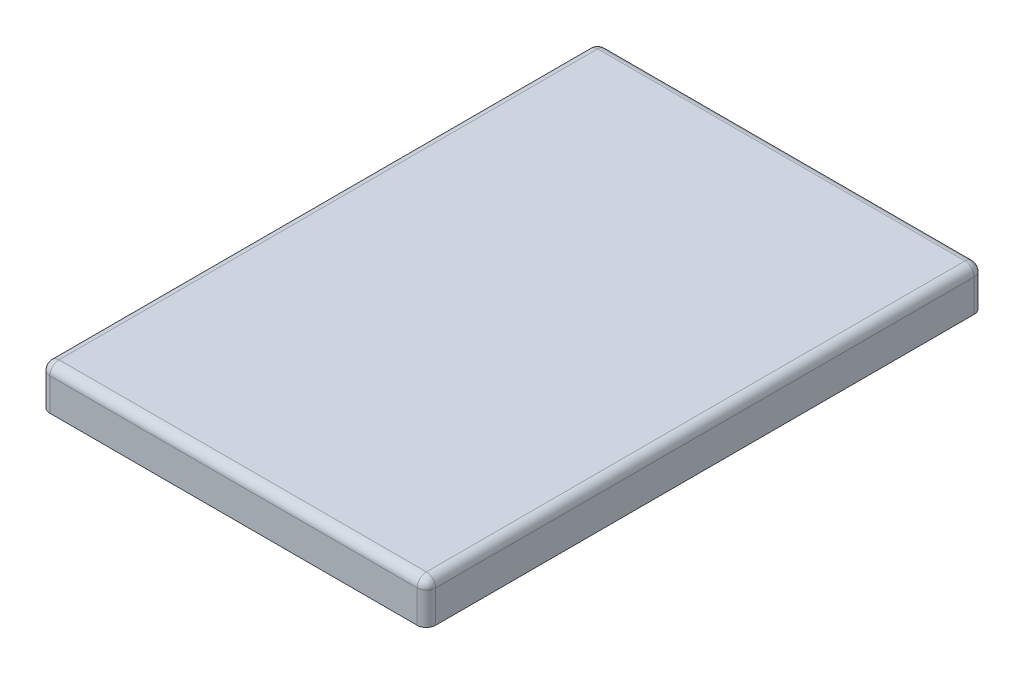
ISO-10303-21;
HEADER;
FILE_DESCRIPTION(('STEP AP214'),'2;1');
FILE_NAME('part.step','',(''),(''),'','','');
FILE_SCHEMA(('AUTOMOTIVE_DESIGN { 1 0 10303 214 1 1 1 1 }'));
ENDSEC;
DATA;
#1=APPLICATION_CONTEXT('core data for automotive mechanical design processes');
#2=APPLICATION_PROTOCOL_DEFINITION('international standard','automotive_design',2000,#1);
#3=PRODUCT_CONTEXT('',#1,'mechanical');
#4=PRODUCT('Part','Part','',(#3));
#5=PRODUCT_RELATED_PRODUCT_CATEGORY('part','',(#4));
#6=PRODUCT_DEFINITION_FORMATION('','',#4);
#7=PRODUCT_DEFINITION_CONTEXT('part definition',#1,'design');
#8=PRODUCT_DEFINITION('design','',#6,#7);
#9=PRODUCT_DEFINITION_SHAPE('','',#8);
#10=(LENGTH_UNIT() NAMED_UNIT(*) SI_UNIT(.MILLI.,.METRE.));
#11=(NAMED_UNIT(*) PLANE_ANGLE_UNIT() SI_UNIT($,.RADIAN.));
#12=(NAMED_UNIT(*) SI_UNIT($,.STERADIAN.) SOLID_ANGLE_UNIT());
#13=UNCERTAINTY_MEASURE_WITH_UNIT(LENGTH_MEASURE(1.E-05),#10,'distance_accuracy_value','');
#14=(GEOMETRIC_REPRESENTATION_CONTEXT(3) GLOBAL_UNCERTAINTY_ASSIGNED_CONTEXT((#13)) GLOBAL_UNIT_ASSIGNED_CONTEXT((#10,
#11,#12)) REPRESENTATION_CONTEXT('',''));
#15=CARTESIAN_POINT('',(0.,0.,0.));
#16=DIRECTION('',(0.,0.,1.));
#17=DIRECTION('',(1.,0.,0.));
#18=AXIS2_PLACEMENT_3D('',#15,#16,#17);
#19=CARTESIAN_POINT('',(0.,-69.3057325889171,0.));
#20=DIRECTION('',(0.,1.,0.));
#21=DIRECTION('',(0.,0.,1.));
#22=AXIS2_PLACEMENT_3D('',#19,#20,#21);
#23=PLANE('',#22);
#24=DIRECTION('',(1.,0.,0.));
#25=VECTOR('',#24,1.);
#26=CARTESIAN_POINT('',(0.,-69.3057325889171,30.));
#27=LINE('',#26,#25);
#28=CARTESIAN_POINT('',(21.75,-69.3057325889171,30.));
#29=VERTEX_POINT('',#28);
#30=CARTESIAN_POINT('',(61.45,-69.3057325889171,30.));
#31=VERTEX_POINT('',#30);
#32=EDGE_CURVE('E353',#29,#31,#27,.T.);
#33=ORIENTED_EDGE('',*,*,#32,.F.);
#34=CARTESIAN_POINT('',(21.75,-69.3057325889171,29.));
#35=DIRECTION('',(0.,1.,0.));
#36=DIRECTION('',(0.,0.,1.));
#37=AXIS2_PLACEMENT_3D('',#34,#35,#36);
#38=CIRCLE('',#37,1.);
#39=CARTESIAN_POINT('',(20.75,-69.3057325889171,29.));
#40=VERTEX_POINT('',#39);
#41=EDGE_CURVE('E395',#29,#40,#38,.F.);
#42=ORIENTED_EDGE('',*,*,#41,.T.);
#43=DIRECTION('',(0.,0.,-1.));
#44=VECTOR('',#43,1.);
#45=CARTESIAN_POINT('',(20.75,-69.3057325889171,0.));
#46=LINE('',#45,#44);
#47=CARTESIAN_POINT('',(20.75,-69.3057325889171,-29.2));
#48=VERTEX_POINT('',#47);
#49=EDGE_CURVE('E350',#40,#48,#46,.T.);
#50=ORIENTED_EDGE('',*,*,#49,.T.);
#51=CARTESIAN_POINT('',(21.75,-69.3057325889171,-29.2));
#52=DIRECTION('',(0.,1.,0.));
#53=DIRECTION('',(0.,0.,1.));
#54=AXIS2_PLACEMENT_3D('',#51,#52,#53);
#55=CIRCLE('',#54,1.);
#56=CARTESIAN_POINT('',(21.75,-69.3057325889171,-30.2));
#57=VERTEX_POINT('',#56);
#58=EDGE_CURVE('E391',#48,#57,#55,.F.);
#59=ORIENTED_EDGE('',*,*,#58,.T.);
#60=DIRECTION('',(1.,0.,0.));
#61=VECTOR('',#60,1.);
#62=CARTESIAN_POINT('',(0.,-69.3057325889171,-30.2));
#63=LINE('',#62,#61);
#64=CARTESIAN_POINT('',(61.45,-69.3057325889171,-30.2));
#65=VERTEX_POINT('',#64);
#66=EDGE_CURVE('E358',#57,#65,#63,.T.);
#67=ORIENTED_EDGE('',*,*,#66,.T.);
#68=CARTESIAN_POINT('',(61.45,-69.3057325889171,-29.2));
#69=DIRECTION('',(0.,1.,0.));
#70=DIRECTION('',(0.,0.,1.));
#71=AXIS2_PLACEMENT_3D('',#68,#69,#70);
#72=CIRCLE('',#71,1.);
#73=CARTESIAN_POINT('',(62.45,-69.3057325889171,-29.2));
#74=VERTEX_POINT('',#73);
#75=EDGE_CURVE('E389',#65,#74,#72,.F.);
#76=ORIENTED_EDGE('',*,*,#75,.T.);
#77=DIRECTION('',(0.,0.,-1.));
#78=VECTOR('',#77,1.);
#79=CARTESIAN_POINT('',(62.45,-69.3057325889171,0.));
#80=LINE('',#79,#78);
#81=CARTESIAN_POINT('',(62.45,-69.3057325889171,29.));
#82=VERTEX_POINT('',#81);
#83=EDGE_CURVE('E356',#82,#74,#80,.T.);
#84=ORIENTED_EDGE('',*,*,#83,.F.);
#85=CARTESIAN_POINT('',(61.45,-69.3057325889171,29.));
#86=DIRECTION('',(0.,1.,0.));
#87=DIRECTION('',(0.,0.,1.));
#88=AXIS2_PLACEMENT_3D('',#85,#86,#87);
#89=CIRCLE('',#88,1.);
#90=EDGE_CURVE('E393',#82,#31,#89,.F.);
#91=ORIENTED_EDGE('',*,*,#90,.T.);
#92=EDGE_LOOP('',(#33,#42,#50,#59,#67,#76,#84,#91));
#93=FACE_BOUND('',#92,.T.);
#94=DIRECTION('',(1.,0.,0.));
#95=VECTOR('',#94,1.);
#96=CARTESIAN_POINT('',(0.,-69.3057325889171,28.75));
#97=LINE('',#96,#95);
#98=CARTESIAN_POINT('',(22.,-69.3057325889171,28.75));
#99=VERTEX_POINT('',#98);
#100=CARTESIAN_POINT('',(61.2,-69.3057325889171,28.75));
#101=VERTEX_POINT('',#100);
#102=EDGE_CURVE('E311',#99,#101,#97,.T.);
#103=ORIENTED_EDGE('',*,*,#102,.T.);
#104=DIRECTION('',(0.,0.,-1.));
#105=VECTOR('',#104,1.);
#106=CARTESIAN_POINT('',(61.2,-69.3057325889171,0.));
#107=LINE('',#106,#105);
#108=CARTESIAN_POINT('',(61.2,-69.3057325889171,-28.95));
#109=VERTEX_POINT('',#108);
#110=EDGE_CURVE('E333',#101,#109,#107,.T.);
#111=ORIENTED_EDGE('',*,*,#110,.T.);
#112=DIRECTION('',(1.,0.,0.));
#113=VECTOR('',#112,1.);
#114=CARTESIAN_POINT('',(0.,-69.3057325889171,-28.95));
#115=LINE('',#114,#113);
#116=CARTESIAN_POINT('',(22.,-69.3057325889171,-28.95));
#117=VERTEX_POINT('',#116);
#118=EDGE_CURVE('E336',#117,#109,#115,.T.);
#119=ORIENTED_EDGE('',*,*,#118,.F.);
#120=DIRECTION('',(0.,0.,-1.));
#121=VECTOR('',#120,1.);
#122=CARTESIAN_POINT('',(22.,-69.3057325889171,0.));
#123=LINE('',#122,#121);
#124=EDGE_CURVE('E322',#99,#117,#123,.T.);
#125=ORIENTED_EDGE('',*,*,#124,.F.);
#126=EDGE_LOOP('',(#103,#111,#119,#125));
#127=FACE_BOUND('',#126,.T.);
#128=ADVANCED_FACE('F39',(#93,#127),#23,.F.);
#129=CARTESIAN_POINT('',(20.75,-64.8057325889171,0.));
#130=DIRECTION('',(-1.,0.,0.));
#131=DIRECTION('',(0.,0.,1.));
#132=AXIS2_PLACEMENT_3D('',#129,#130,#131);
#133=PLANE('',#132);
#134=ORIENTED_EDGE('',*,*,#49,.F.);
#135=DIRECTION('',(0.,-1.,0.));
#136=VECTOR('',#135,1.);
#137=CARTESIAN_POINT('',(20.75,-64.8057325889171,29.));
#138=LINE('',#137,#136);
#139=CARTESIAN_POINT('',(20.75,-65.8057325889171,29.));
#140=VERTEX_POINT('',#139);
#141=EDGE_CURVE('E387',#40,#140,#138,.F.);
#142=ORIENTED_EDGE('',*,*,#141,.T.);
#143=DIRECTION('',(0.,0.,-1.));
#144=VECTOR('',#143,1.);
#145=CARTESIAN_POINT('',(20.75,-65.8057325889171,0.));
#146=LINE('',#145,#144);
#147=CARTESIAN_POINT('',(20.75,-65.8057325889171,-29.2));
#148=VERTEX_POINT('',#147);
#149=EDGE_CURVE('E385',#140,#148,#146,.T.);
#150=ORIENTED_EDGE('',*,*,#149,.T.);
#151=DIRECTION('',(0.,-1.,0.));
#152=VECTOR('',#151,1.);
#153=CARTESIAN_POINT('',(20.75,-64.8057325889171,-29.2));
#154=LINE('',#153,#152);
#155=EDGE_CURVE('E383',#148,#48,#154,.T.);
#156=ORIENTED_EDGE('',*,*,#155,.T.);
#157=EDGE_LOOP('',(#134,#142,#150,#156));
#158=FACE_BOUND('',#157,.T.);
#159=ADVANCED_FACE('F445',(#158),#133,.T.);
#160=CARTESIAN_POINT('',(0.,-64.8057325889171,30.));
#161=DIRECTION('',(0.,0.,-1.));
#162=DIRECTION('',(-1.,0.,0.));
#163=AXIS2_PLACEMENT_3D('',#160,#161,#162);
#164=PLANE('',#163);
#165=DIRECTION('',(1.,0.,0.));
#166=VECTOR('',#165,1.);
#167=CARTESIAN_POINT('',(20.75,-65.8057325889171,30.));
#168=LINE('',#167,#166);
#169=CARTESIAN_POINT('',(61.45,-65.8057325889171,30.));
#170=VERTEX_POINT('',#169);
#171=CARTESIAN_POINT('',(21.75,-65.8057325889171,30.));
#172=VERTEX_POINT('',#171);
#173=EDGE_CURVE('E379',#170,#172,#168,.F.);
#174=ORIENTED_EDGE('',*,*,#173,.T.);
#175=DIRECTION('',(0.,-1.,0.));
#176=VECTOR('',#175,1.);
#177=CARTESIAN_POINT('',(21.75,-69.3057325889171,30.));
#178=LINE('',#177,#176);
#179=EDGE_CURVE('E381',#172,#29,#178,.T.);
#180=ORIENTED_EDGE('',*,*,#179,.T.);
#181=ORIENTED_EDGE('',*,*,#32,.T.);
#182=DIRECTION('',(0.,-1.,0.));
#183=VECTOR('',#182,1.);
#184=CARTESIAN_POINT('',(61.45,-64.8057325889171,30.));
#185=LINE('',#184,#183);
#186=EDGE_CURVE('E377',#31,#170,#185,.F.);
#187=ORIENTED_EDGE('',*,*,#186,.T.);
#188=EDGE_LOOP('',(#174,#180,#181,#187));
#189=FACE_BOUND('',#188,.T.);
#190=ADVANCED_FACE('F486',(#189),#164,.F.);
#191=CARTESIAN_POINT('',(62.45,-64.8057325889171,0.));
#192=DIRECTION('',(-1.,0.,0.));
#193=DIRECTION('',(0.,0.,1.));
#194=AXIS2_PLACEMENT_3D('',#191,#192,#193);
#195=PLANE('',#194);
#196=DIRECTION('',(0.,0.,-1.));
#197=VECTOR('',#196,1.);
#198=CARTESIAN_POINT('',(62.45,-65.8057325889171,30.));
#199=LINE('',#198,#197);
#200=CARTESIAN_POINT('',(62.45,-65.8057325889171,-29.2));
#201=VERTEX_POINT('',#200);
#202=CARTESIAN_POINT('',(62.45,-65.8057325889171,29.));
#203=VERTEX_POINT('',#202);
#204=EDGE_CURVE('E55',#201,#203,#199,.F.);
#205=ORIENTED_EDGE('',*,*,#204,.T.);
#206=DIRECTION('',(0.,-1.,0.));
#207=VECTOR('',#206,1.);
#208=CARTESIAN_POINT('',(62.45,-64.8057325889171,29.));
#209=LINE('',#208,#207);
#210=EDGE_CURVE('E11',#203,#82,#209,.T.);
#211=ORIENTED_EDGE('',*,*,#210,.T.);
#212=ORIENTED_EDGE('',*,*,#83,.T.);
#213=DIRECTION('',(0.,-1.,0.));
#214=VECTOR('',#213,1.);
#215=CARTESIAN_POINT('',(62.45,-64.8057325889171,-29.2));
#216=LINE('',#215,#214);
#217=EDGE_CURVE('E48',#74,#201,#216,.F.);
#218=ORIENTED_EDGE('',*,*,#217,.T.);
#219=EDGE_LOOP('',(#205,#211,#212,#218));
#220=FACE_BOUND('',#219,.T.);
#221=ADVANCED_FACE('F467',(#220),#195,.F.);
#222=CARTESIAN_POINT('',(0.,-64.8057325889171,-30.2));
#223=DIRECTION('',(0.,0.,-1.));
#224=DIRECTION('',(-1.,0.,0.));
#225=AXIS2_PLACEMENT_3D('',#222,#223,#224);
#226=PLANE('',#225);
#227=ORIENTED_EDGE('',*,*,#66,.F.);
#228=DIRECTION('',(0.,-1.,0.));
#229=VECTOR('',#228,1.);
#230=CARTESIAN_POINT('',(21.75,-64.8057325889171,-30.2));
#231=LINE('',#230,#229);
#232=CARTESIAN_POINT('',(21.75,-65.8057325889171,-30.2));
#233=VERTEX_POINT('',#232);
#234=EDGE_CURVE('E366',#57,#233,#231,.F.);
#235=ORIENTED_EDGE('',*,*,#234,.T.);
#236=DIRECTION('',(1.,0.,0.));
#237=VECTOR('',#236,1.);
#238=CARTESIAN_POINT('',(0.,-65.8057325889171,-30.2));
#239=LINE('',#238,#237);
#240=CARTESIAN_POINT('',(61.45,-65.8057325889171,-30.2));
#241=VERTEX_POINT('',#240);
#242=EDGE_CURVE('E363',#233,#241,#239,.T.);
#243=ORIENTED_EDGE('',*,*,#242,.T.);
#244=DIRECTION('',(0.,-1.,0.));
#245=VECTOR('',#244,1.);
#246=CARTESIAN_POINT('',(61.45,-69.3057325889171,-30.2));
#247=LINE('',#246,#245);
#248=EDGE_CURVE('E361',#241,#65,#247,.T.);
#249=ORIENTED_EDGE('',*,*,#248,.T.);
#250=EDGE_LOOP('',(#227,#235,#243,#249));
#251=FACE_BOUND('',#250,.T.);
#252=ADVANCED_FACE('F459',(#251),#226,.T.);
#253=CARTESIAN_POINT('',(0.,-64.8057325889171,0.));
#254=DIRECTION('',(0.,1.,0.));
#255=DIRECTION('',(0.,0.,1.));
#256=AXIS2_PLACEMENT_3D('',#253,#254,#255);
#257=PLANE('',#256);
#258=DIRECTION('',(1.,0.,0.));
#259=VECTOR('',#258,1.);
#260=CARTESIAN_POINT('',(0.,-64.8057325889171,-29.2));
#261=LINE('',#260,#259);
#262=CARTESIAN_POINT('',(61.45,-64.8057325889171,-29.2));
#263=VERTEX_POINT('',#262);
#264=CARTESIAN_POINT('',(21.75,-64.8057325889171,-29.2));
#265=VERTEX_POINT('',#264);
#266=EDGE_CURVE('E372',#263,#265,#261,.F.);
#267=ORIENTED_EDGE('',*,*,#266,.T.);
#268=DIRECTION('',(0.,0.,-1.));
#269=VECTOR('',#268,1.);
#270=CARTESIAN_POINT('',(21.75,-64.8057325889171,0.));
#271=LINE('',#270,#269);
#272=CARTESIAN_POINT('',(21.75,-64.8057325889171,29.));
#273=VERTEX_POINT('',#272);
#274=EDGE_CURVE('E375',#265,#273,#271,.F.);
#275=ORIENTED_EDGE('',*,*,#274,.T.);
#276=DIRECTION('',(1.,0.,0.));
#277=VECTOR('',#276,1.);
#278=CARTESIAN_POINT('',(62.45,-64.8057325889171,29.));
#279=LINE('',#278,#277);
#280=CARTESIAN_POINT('',(61.45,-64.8057325889171,29.));
#281=VERTEX_POINT('',#280);
#282=EDGE_CURVE('E370',#273,#281,#279,.T.);
#283=ORIENTED_EDGE('',*,*,#282,.T.);
#284=DIRECTION('',(0.,0.,-1.));
#285=VECTOR('',#284,1.);
#286=CARTESIAN_POINT('',(61.45,-64.8057325889171,-30.2));
#287=LINE('',#286,#285);
#288=EDGE_CURVE('E368',#281,#263,#287,.T.);
#289=ORIENTED_EDGE('',*,*,#288,.T.);
#290=EDGE_LOOP('',(#267,#275,#283,#289));
#291=FACE_BOUND('',#290,.T.);
#292=ADVANCED_FACE('F482',(#291),#257,.T.);
#293=CARTESIAN_POINT('',(0.,-66.6557325889171,28.75));
#294=DIRECTION('',(0.,0.,-1.));
#295=DIRECTION('',(-1.,0.,0.));
#296=AXIS2_PLACEMENT_3D('',#293,#294,#295);
#297=PLANE('',#296);
#298=DIRECTION('',(0.,-1.,0.));
#299=VECTOR('',#298,1.);
#300=CARTESIAN_POINT('',(51.2,-67.6057325889171,28.75));
#301=LINE('',#300,#299);
#302=CARTESIAN_POINT('',(51.2,-67.6057325889171,28.75));
#303=VERTEX_POINT('',#302);
#304=CARTESIAN_POINT('',(51.2,-68.5057325889171,28.75));
#305=VERTEX_POINT('',#304);
#306=EDGE_CURVE('E218',#303,#305,#301,.T.);
#307=ORIENTED_EDGE('',*,*,#306,.F.);
#308=DIRECTION('',(1.,0.,0.));
#309=VECTOR('',#308,1.);
#310=CARTESIAN_POINT('',(51.2,-67.6057325889171,28.75));
#311=LINE('',#310,#309);
#312=CARTESIAN_POINT('',(32.,-67.6057325889171,28.75));
#313=VERTEX_POINT('',#312);
#314=EDGE_CURVE('E235',#313,#303,#311,.T.);
#315=ORIENTED_EDGE('',*,*,#314,.F.);
#316=DIRECTION('',(0.,1.,0.));
#317=VECTOR('',#316,1.);
#318=CARTESIAN_POINT('',(32.,-67.6057325889171,28.75));
#319=LINE('',#318,#317);
#320=CARTESIAN_POINT('',(32.,-68.5057325889171,28.75));
#321=VERTEX_POINT('',#320);
#322=EDGE_CURVE('E238',#321,#313,#319,.T.);
#323=ORIENTED_EDGE('',*,*,#322,.F.);
#324=DIRECTION('',(-1.,0.,0.));
#325=VECTOR('',#324,1.);
#326=CARTESIAN_POINT('',(51.2,-68.5057325889171,28.75));
#327=LINE('',#326,#325);
#328=EDGE_CURVE('E244',#305,#321,#327,.T.);
#329=ORIENTED_EDGE('',*,*,#328,.F.);
#330=EDGE_LOOP('',(#307,#315,#323,#329));
#331=FACE_BOUND('',#330,.T.);
#332=ORIENTED_EDGE('',*,*,#102,.F.);
#333=DIRECTION('',(0.,-1.,0.));
#334=VECTOR('',#333,1.);
#335=CARTESIAN_POINT('',(22.,-66.6557325889171,28.75));
#336=LINE('',#335,#334);
#337=CARTESIAN_POINT('',(22.,-66.6557325889171,28.75));
#338=VERTEX_POINT('',#337);
#339=EDGE_CURVE('E330',#338,#99,#336,.T.);
#340=ORIENTED_EDGE('',*,*,#339,.F.);
#341=DIRECTION('',(1.,0.,0.));
#342=VECTOR('',#341,1.);
#343=CARTESIAN_POINT('',(0.,-66.6557325889171,28.75));
#344=LINE('',#343,#342);
#345=CARTESIAN_POINT('',(61.2,-66.6557325889171,28.75));
#346=VERTEX_POINT('',#345);
#347=EDGE_CURVE('E318',#338,#346,#344,.T.);
#348=ORIENTED_EDGE('',*,*,#347,.T.);
#349=DIRECTION('',(0.,-1.,0.));
#350=VECTOR('',#349,1.);
#351=CARTESIAN_POINT('',(61.2,-66.6557325889171,28.75));
#352=LINE('',#351,#350);
#353=EDGE_CURVE('E347',#346,#101,#352,.T.);
#354=ORIENTED_EDGE('',*,*,#353,.T.);
#355=EDGE_LOOP('',(#332,#340,#348,#354));
#356=FACE_BOUND('',#355,.T.);
#357=ADVANCED_FACE('F829',(#331,#356),#297,.T.);
#358=CARTESIAN_POINT('',(61.2,-66.6557325889171,0.));
#359=DIRECTION('',(-1.,0.,0.));
#360=DIRECTION('',(0.,0.,1.));
#361=AXIS2_PLACEMENT_3D('',#358,#359,#360);
#362=PLANE('',#361);
#363=DIRECTION('',(0.,-1.,0.));
#364=VECTOR('',#363,1.);
#365=CARTESIAN_POINT('',(61.2,-67.4557325889171,-18.95));
#366=LINE('',#365,#364);
#367=CARTESIAN_POINT('',(61.2,-67.4557325889171,-18.95));
#368=VERTEX_POINT('',#367);
#369=CARTESIAN_POINT('',(61.2,-68.5057325889171,-18.95));
#370=VERTEX_POINT('',#369);
#371=EDGE_CURVE('E250',#368,#370,#366,.T.);
#372=ORIENTED_EDGE('',*,*,#371,.F.);
#373=DIRECTION('',(0.,0.,-1.));
#374=VECTOR('',#373,1.);
#375=CARTESIAN_POINT('',(61.2,-67.4557325889171,-18.95));
#376=LINE('',#375,#374);
#377=CARTESIAN_POINT('',(61.2,-67.4557325889171,18.75));
#378=VERTEX_POINT('',#377);
#379=EDGE_CURVE('E258',#378,#368,#376,.T.);
#380=ORIENTED_EDGE('',*,*,#379,.F.);
#381=DIRECTION('',(0.,1.,0.));
#382=VECTOR('',#381,1.);
#383=CARTESIAN_POINT('',(61.2,-67.4557325889171,18.75));
#384=LINE('',#383,#382);
#385=CARTESIAN_POINT('',(61.2,-68.5057325889171,18.75));
#386=VERTEX_POINT('',#385);
#387=EDGE_CURVE('E272',#386,#378,#384,.T.);
#388=ORIENTED_EDGE('',*,*,#387,.F.);
#389=DIRECTION('',(0.,0.,1.));
#390=VECTOR('',#389,1.);
#391=CARTESIAN_POINT('',(61.2,-68.5057325889171,-18.95));
#392=LINE('',#391,#390);
#393=EDGE_CURVE('E269',#370,#386,#392,.T.);
#394=ORIENTED_EDGE('',*,*,#393,.F.);
#395=EDGE_LOOP('',(#372,#380,#388,#394));
#396=FACE_BOUND('',#395,.T.);
#397=ORIENTED_EDGE('',*,*,#110,.F.);
#398=ORIENTED_EDGE('',*,*,#353,.F.);
#399=DIRECTION('',(0.,0.,-1.));
#400=VECTOR('',#399,1.);
#401=CARTESIAN_POINT('',(61.2,-66.6557325889171,0.));
#402=LINE('',#401,#400);
#403=CARTESIAN_POINT('',(61.2,-66.6557325889171,-28.95));
#404=VERTEX_POINT('',#403);
#405=EDGE_CURVE('E321',#346,#404,#402,.T.);
#406=ORIENTED_EDGE('',*,*,#405,.T.);
#407=DIRECTION('',(0.,-1.,0.));
#408=VECTOR('',#407,1.);
#409=CARTESIAN_POINT('',(61.2,-66.6557325889171,-28.95));
#410=LINE('',#409,#408);
#411=EDGE_CURVE('E345',#404,#109,#410,.T.);
#412=ORIENTED_EDGE('',*,*,#411,.T.);
#413=EDGE_LOOP('',(#397,#398,#406,#412));
#414=FACE_BOUND('',#413,.T.);
#415=ADVANCED_FACE('F819',(#396,#414),#362,.T.);
#416=CARTESIAN_POINT('',(0.,-66.6557325889171,-28.95));
#417=DIRECTION('',(0.,0.,-1.));
#418=DIRECTION('',(-1.,0.,0.));
#419=AXIS2_PLACEMENT_3D('',#416,#417,#418);
#420=PLANE('',#419);
#421=DIRECTION('',(1.,0.,0.));
#422=VECTOR('',#421,1.);
#423=CARTESIAN_POINT('',(41.15,-68.5057325889171,-28.95));
#424=LINE('',#423,#422);
#425=CARTESIAN_POINT('',(41.15,-68.5057325889171,-28.95));
#426=VERTEX_POINT('',#425);
#427=CARTESIAN_POINT('',(58.2,-68.5057325889171,-28.95));
#428=VERTEX_POINT('',#427);
#429=EDGE_CURVE('E301',#426,#428,#424,.T.);
#430=ORIENTED_EDGE('',*,*,#429,.F.);
#431=DIRECTION('',(0.,-1.,0.));
#432=VECTOR('',#431,1.);
#433=CARTESIAN_POINT('',(41.15,-67.6057325889171,-28.95));
#434=LINE('',#433,#432);
#435=CARTESIAN_POINT('',(41.15,-67.6057325889171,-28.95));
#436=VERTEX_POINT('',#435);
#437=EDGE_CURVE('E279',#436,#426,#434,.T.);
#438=ORIENTED_EDGE('',*,*,#437,.F.);
#439=DIRECTION('',(-1.,0.,0.));
#440=VECTOR('',#439,1.);
#441=CARTESIAN_POINT('',(41.15,-67.6057325889171,-28.95));
#442=LINE('',#441,#440);
#443=CARTESIAN_POINT('',(58.2,-67.6057325889171,-28.95));
#444=VERTEX_POINT('',#443);
#445=EDGE_CURVE('E290',#444,#436,#442,.T.);
#446=ORIENTED_EDGE('',*,*,#445,.F.);
#447=DIRECTION('',(0.,1.,0.));
#448=VECTOR('',#447,1.);
#449=CARTESIAN_POINT('',(58.2,-67.6057325889171,-28.95));
#450=LINE('',#449,#448);
#451=EDGE_CURVE('E304',#428,#444,#450,.T.);
#452=ORIENTED_EDGE('',*,*,#451,.F.);
#453=EDGE_LOOP('',(#430,#438,#446,#452));
#454=FACE_BOUND('',#453,.T.);
#455=ORIENTED_EDGE('',*,*,#118,.T.);
#456=ORIENTED_EDGE('',*,*,#411,.F.);
#457=DIRECTION('',(1.,0.,0.));
#458=VECTOR('',#457,1.);
#459=CARTESIAN_POINT('',(0.,-66.6557325889171,-28.95));
#460=LINE('',#459,#458);
#461=CARTESIAN_POINT('',(22.,-66.6557325889171,-28.95));
#462=VERTEX_POINT('',#461);
#463=EDGE_CURVE('E324',#462,#404,#460,.T.);
#464=ORIENTED_EDGE('',*,*,#463,.F.);
#465=DIRECTION('',(0.,-1.,0.));
#466=VECTOR('',#465,1.);
#467=CARTESIAN_POINT('',(22.,-66.6557325889171,-28.95));
#468=LINE('',#467,#466);
#469=EDGE_CURVE('E343',#462,#117,#468,.T.);
#470=ORIENTED_EDGE('',*,*,#469,.T.);
#471=EDGE_LOOP('',(#455,#456,#464,#470));
#472=FACE_BOUND('',#471,.T.);
#473=ADVANCED_FACE('F809',(#454,#472),#420,.F.);
#474=CARTESIAN_POINT('',(22.,-66.6557325889171,0.));
#475=DIRECTION('',(-1.,0.,0.));
#476=DIRECTION('',(0.,0.,1.));
#477=AXIS2_PLACEMENT_3D('',#474,#475,#476);
#478=PLANE('',#477);
#479=ORIENTED_EDGE('',*,*,#124,.T.);
#480=ORIENTED_EDGE('',*,*,#469,.F.);
#481=DIRECTION('',(0.,0.,-1.));
#482=VECTOR('',#481,1.);
#483=CARTESIAN_POINT('',(22.,-66.6557325889171,0.));
#484=LINE('',#483,#482);
#485=EDGE_CURVE('E327',#338,#462,#484,.T.);
#486=ORIENTED_EDGE('',*,*,#485,.F.);
#487=ORIENTED_EDGE('',*,*,#339,.T.);
#488=EDGE_LOOP('',(#479,#480,#486,#487));
#489=FACE_BOUND('',#488,.T.);
#490=ADVANCED_FACE('F798',(#489),#478,.F.);
#491=CARTESIAN_POINT('',(0.,-66.6557325889171,0.));
#492=DIRECTION('',(0.,1.,0.));
#493=DIRECTION('',(0.,0.,1.));
#494=AXIS2_PLACEMENT_3D('',#491,#492,#493);
#495=PLANE('',#494);
#496=ORIENTED_EDGE('',*,*,#347,.F.);
#497=ORIENTED_EDGE('',*,*,#485,.T.);
#498=ORIENTED_EDGE('',*,*,#463,.T.);
#499=ORIENTED_EDGE('',*,*,#405,.F.);
#500=EDGE_LOOP('',(#496,#497,#498,#499));
#501=FACE_BOUND('',#500,.T.);
#502=ADVANCED_FACE('F786',(#501),#495,.F.);
#503=CARTESIAN_POINT('',(41.15,-67.6057325889171,-29.7));
#504=DIRECTION('',(-1.,0.,0.));
#505=DIRECTION('',(0.,-1.,0.));
#506=AXIS2_PLACEMENT_3D('',#503,#504,#505);
#507=PLANE('',#506);
#508=ORIENTED_EDGE('',*,*,#437,.T.);
#509=DIRECTION('',(0.,0.,1.));
#510=VECTOR('',#509,1.);
#511=CARTESIAN_POINT('',(41.15,-68.5057325889171,-29.7));
#512=LINE('',#511,#510);
#513=CARTESIAN_POINT('',(41.15,-68.5057325889171,-29.7));
#514=VERTEX_POINT('',#513);
#515=EDGE_CURVE('E299',#514,#426,#512,.T.);
#516=ORIENTED_EDGE('',*,*,#515,.F.);
#517=DIRECTION('',(0.,-1.,0.));
#518=VECTOR('',#517,1.);
#519=CARTESIAN_POINT('',(41.15,-67.6057325889171,-29.7));
#520=LINE('',#519,#518);
#521=CARTESIAN_POINT('',(41.15,-67.6057325889171,-29.7));
#522=VERTEX_POINT('',#521);
#523=EDGE_CURVE('E286',#522,#514,#520,.T.);
#524=ORIENTED_EDGE('',*,*,#523,.F.);
#525=DIRECTION('',(0.,0.,1.));
#526=VECTOR('',#525,1.);
#527=CARTESIAN_POINT('',(41.15,-67.6057325889171,-29.7));
#528=LINE('',#527,#526);
#529=EDGE_CURVE('E309',#522,#436,#528,.T.);
#530=ORIENTED_EDGE('',*,*,#529,.T.);
#531=EDGE_LOOP('',(#508,#516,#524,#530));
#532=FACE_BOUND('',#531,.T.);
#533=ADVANCED_FACE('F775',(#532),#507,.F.);
#534=CARTESIAN_POINT('',(41.15,-67.6057325889171,-29.7));
#535=DIRECTION('',(0.,1.,0.));
#536=DIRECTION('',(0.,0.,1.));
#537=AXIS2_PLACEMENT_3D('',#534,#535,#536);
#538=PLANE('',#537);
#539=ORIENTED_EDGE('',*,*,#445,.T.);
#540=ORIENTED_EDGE('',*,*,#529,.F.);
#541=DIRECTION('',(-1.,0.,0.));
#542=VECTOR('',#541,1.);
#543=CARTESIAN_POINT('',(41.15,-67.6057325889171,-29.7));
#544=LINE('',#543,#542);
#545=CARTESIAN_POINT('',(58.2,-67.6057325889171,-29.7));
#546=VERTEX_POINT('',#545);
#547=EDGE_CURVE('E296',#546,#522,#544,.T.);
#548=ORIENTED_EDGE('',*,*,#547,.F.);
#549=DIRECTION('',(0.,0.,1.));
#550=VECTOR('',#549,1.);
#551=CARTESIAN_POINT('',(58.2,-67.6057325889171,-29.7));
#552=LINE('',#551,#550);
#553=EDGE_CURVE('E312',#546,#444,#552,.T.);
#554=ORIENTED_EDGE('',*,*,#553,.T.);
#555=EDGE_LOOP('',(#539,#540,#548,#554));
#556=FACE_BOUND('',#555,.T.);
#557=ADVANCED_FACE('F764',(#556),#538,.F.);
#558=CARTESIAN_POINT('',(58.2,-67.6057325889171,-29.7));
#559=DIRECTION('',(1.,0.,0.));
#560=DIRECTION('',(0.,1.,0.));
#561=AXIS2_PLACEMENT_3D('',#558,#559,#560);
#562=PLANE('',#561);
#563=ORIENTED_EDGE('',*,*,#451,.T.);
#564=ORIENTED_EDGE('',*,*,#553,.F.);
#565=DIRECTION('',(0.,1.,0.));
#566=VECTOR('',#565,1.);
#567=CARTESIAN_POINT('',(58.2,-67.6057325889171,-29.7));
#568=LINE('',#567,#566);
#569=CARTESIAN_POINT('',(58.2,-68.5057325889171,-29.7));
#570=VERTEX_POINT('',#569);
#571=EDGE_CURVE('E293',#570,#546,#568,.T.);
#572=ORIENTED_EDGE('',*,*,#571,.F.);
#573=DIRECTION('',(0.,0.,1.));
#574=VECTOR('',#573,1.);
#575=CARTESIAN_POINT('',(58.2,-68.5057325889171,-29.7));
#576=LINE('',#575,#574);
#577=EDGE_CURVE('E314',#570,#428,#576,.T.);
#578=ORIENTED_EDGE('',*,*,#577,.T.);
#579=EDGE_LOOP('',(#563,#564,#572,#578));
#580=FACE_BOUND('',#579,.T.);
#581=ADVANCED_FACE('F753',(#580),#562,.F.);
#582=CARTESIAN_POINT('',(41.15,-68.5057325889171,-29.7));
#583=DIRECTION('',(0.,-1.,0.));
#584=DIRECTION('',(0.,0.,-1.));
#585=AXIS2_PLACEMENT_3D('',#582,#583,#584);
#586=PLANE('',#585);
#587=ORIENTED_EDGE('',*,*,#429,.T.);
#588=ORIENTED_EDGE('',*,*,#577,.F.);
#589=DIRECTION('',(1.,0.,0.));
#590=VECTOR('',#589,1.);
#591=CARTESIAN_POINT('',(41.15,-68.5057325889171,-29.7));
#592=LINE('',#591,#590);
#593=EDGE_CURVE('E289',#514,#570,#592,.T.);
#594=ORIENTED_EDGE('',*,*,#593,.F.);
#595=ORIENTED_EDGE('',*,*,#515,.T.);
#596=EDGE_LOOP('',(#587,#588,#594,#595));
#597=FACE_BOUND('',#596,.T.);
#598=ADVANCED_FACE('F742',(#597),#586,.F.);
#599=CARTESIAN_POINT('',(0.,0.,-29.7));
#600=DIRECTION('',(0.,0.,1.));
#601=DIRECTION('',(1.,0.,0.));
#602=AXIS2_PLACEMENT_3D('',#599,#600,#601);
#603=PLANE('',#602);
#604=ORIENTED_EDGE('',*,*,#523,.T.);
#605=ORIENTED_EDGE('',*,*,#593,.T.);
#606=ORIENTED_EDGE('',*,*,#571,.T.);
#607=ORIENTED_EDGE('',*,*,#547,.T.);
#608=EDGE_LOOP('',(#604,#605,#606,#607));
#609=FACE_BOUND('',#608,.T.);
#610=ADVANCED_FACE('F730',(#609),#603,.T.);
#611=CARTESIAN_POINT('',(61.95,-67.4557325889171,-18.95));
#612=DIRECTION('',(0.,0.,-1.));
#613=DIRECTION('',(-1.,0.,0.));
#614=AXIS2_PLACEMENT_3D('',#611,#612,#613);
#615=PLANE('',#614);
#616=ORIENTED_EDGE('',*,*,#371,.T.);
#617=DIRECTION('',(-1.,0.,0.));
#618=VECTOR('',#617,1.);
#619=CARTESIAN_POINT('',(61.95,-68.5057325889171,-18.95));
#620=LINE('',#619,#618);
#621=CARTESIAN_POINT('',(61.95,-68.5057325889171,-18.95));
#622=VERTEX_POINT('',#621);
#623=EDGE_CURVE('E267',#622,#370,#620,.T.);
#624=ORIENTED_EDGE('',*,*,#623,.F.);
#625=DIRECTION('',(0.,-1.,0.));
#626=VECTOR('',#625,1.);
#627=CARTESIAN_POINT('',(61.95,-67.4557325889171,-18.95));
#628=LINE('',#627,#626);
#629=CARTESIAN_POINT('',(61.95,-67.4557325889171,-18.95));
#630=VERTEX_POINT('',#629);
#631=EDGE_CURVE('E254',#630,#622,#628,.T.);
#632=ORIENTED_EDGE('',*,*,#631,.F.);
#633=DIRECTION('',(-1.,0.,0.));
#634=VECTOR('',#633,1.);
#635=CARTESIAN_POINT('',(61.95,-67.4557325889171,-18.95));
#636=LINE('',#635,#634);
#637=EDGE_CURVE('E277',#630,#368,#636,.T.);
#638=ORIENTED_EDGE('',*,*,#637,.T.);
#639=EDGE_LOOP('',(#616,#624,#632,#638));
#640=FACE_BOUND('',#639,.T.);
#641=ADVANCED_FACE('F719',(#640),#615,.F.);
#642=CARTESIAN_POINT('',(61.95,-67.4557325889171,-18.95));
#643=DIRECTION('',(0.,1.,0.));
#644=DIRECTION('',(0.,0.,1.));
#645=AXIS2_PLACEMENT_3D('',#642,#643,#644);
#646=PLANE('',#645);
#647=ORIENTED_EDGE('',*,*,#379,.T.);
#648=ORIENTED_EDGE('',*,*,#637,.F.);
#649=DIRECTION('',(0.,0.,-1.));
#650=VECTOR('',#649,1.);
#651=CARTESIAN_POINT('',(61.95,-67.4557325889171,-18.95));
#652=LINE('',#651,#650);
#653=CARTESIAN_POINT('',(61.95,-67.4557325889171,18.75));
#654=VERTEX_POINT('',#653);
#655=EDGE_CURVE('E264',#654,#630,#652,.T.);
#656=ORIENTED_EDGE('',*,*,#655,.F.);
#657=DIRECTION('',(-1.,0.,0.));
#658=VECTOR('',#657,1.);
#659=CARTESIAN_POINT('',(61.95,-67.4557325889171,18.75));
#660=LINE('',#659,#658);
#661=EDGE_CURVE('E280',#654,#378,#660,.T.);
#662=ORIENTED_EDGE('',*,*,#661,.T.);
#663=EDGE_LOOP('',(#647,#648,#656,#662));
#664=FACE_BOUND('',#663,.T.);
#665=ADVANCED_FACE('F708',(#664),#646,.F.);
#666=CARTESIAN_POINT('',(61.95,-67.4557325889171,18.75));
#667=DIRECTION('',(0.,0.,1.));
#668=DIRECTION('',(1.,0.,0.));
#669=AXIS2_PLACEMENT_3D('',#666,#667,#668);
#670=PLANE('',#669);
#671=ORIENTED_EDGE('',*,*,#387,.T.);
#672=ORIENTED_EDGE('',*,*,#661,.F.);
#673=DIRECTION('',(0.,1.,0.));
#674=VECTOR('',#673,1.);
#675=CARTESIAN_POINT('',(61.95,-67.4557325889171,18.75));
#676=LINE('',#675,#674);
#677=CARTESIAN_POINT('',(61.95,-68.5057325889171,18.75));
#678=VERTEX_POINT('',#677);
#679=EDGE_CURVE('E261',#678,#654,#676,.T.);
#680=ORIENTED_EDGE('',*,*,#679,.F.);
#681=DIRECTION('',(-1.,0.,0.));
#682=VECTOR('',#681,1.);
#683=CARTESIAN_POINT('',(61.95,-68.5057325889171,18.75));
#684=LINE('',#683,#682);
#685=EDGE_CURVE('E282',#678,#386,#684,.T.);
#686=ORIENTED_EDGE('',*,*,#685,.T.);
#687=EDGE_LOOP('',(#671,#672,#680,#686));
#688=FACE_BOUND('',#687,.T.);
#689=ADVANCED_FACE('F697',(#688),#670,.F.);
#690=CARTESIAN_POINT('',(61.95,-68.5057325889171,-18.95));
#691=DIRECTION('',(0.,-1.,0.));
#692=DIRECTION('',(0.,0.,-1.));
#693=AXIS2_PLACEMENT_3D('',#690,#691,#692);
#694=PLANE('',#693);
#695=ORIENTED_EDGE('',*,*,#393,.T.);
#696=ORIENTED_EDGE('',*,*,#685,.F.);
#697=DIRECTION('',(0.,0.,1.));
#698=VECTOR('',#697,1.);
#699=CARTESIAN_POINT('',(61.95,-68.5057325889171,-18.95));
#700=LINE('',#699,#698);
#701=EDGE_CURVE('E257',#622,#678,#700,.T.);
#702=ORIENTED_EDGE('',*,*,#701,.F.);
#703=ORIENTED_EDGE('',*,*,#623,.T.);
#704=EDGE_LOOP('',(#695,#696,#702,#703));
#705=FACE_BOUND('',#704,.T.);
#706=ADVANCED_FACE('F686',(#705),#694,.F.);
#707=CARTESIAN_POINT('',(61.95,0.,0.));
#708=DIRECTION('',(-1.,0.,0.));
#709=DIRECTION('',(0.,0.,1.));
#710=AXIS2_PLACEMENT_3D('',#707,#708,#709);
#711=PLANE('',#710);
#712=ORIENTED_EDGE('',*,*,#631,.T.);
#713=ORIENTED_EDGE('',*,*,#701,.T.);
#714=ORIENTED_EDGE('',*,*,#679,.T.);
#715=ORIENTED_EDGE('',*,*,#655,.T.);
#716=EDGE_LOOP('',(#712,#713,#714,#715));
#717=FACE_BOUND('',#716,.T.);
#718=ADVANCED_FACE('F675',(#717),#711,.T.);
#719=CARTESIAN_POINT('',(51.2,-67.6057325889171,29.5));
#720=DIRECTION('',(1.,0.,0.));
#721=DIRECTION('',(0.,0.,-1.));
#722=AXIS2_PLACEMENT_3D('',#719,#720,#721);
#723=PLANE('',#722);
#724=ORIENTED_EDGE('',*,*,#306,.T.);
#725=DIRECTION('',(0.,0.,-1.));
#726=VECTOR('',#725,1.);
#727=CARTESIAN_POINT('',(51.2,-68.5057325889171,29.5));
#728=LINE('',#727,#726);
#729=CARTESIAN_POINT('',(51.2,-68.5057325889171,29.5));
#730=VERTEX_POINT('',#729);
#731=EDGE_CURVE('E211',#730,#305,#728,.T.);
#732=ORIENTED_EDGE('',*,*,#731,.F.);
#733=DIRECTION('',(0.,-1.,0.));
#734=VECTOR('',#733,1.);
#735=CARTESIAN_POINT('',(51.2,-67.6057325889171,29.5));
#736=LINE('',#735,#734);
#737=CARTESIAN_POINT('',(51.2,-67.6057325889171,29.5));
#738=VERTEX_POINT('',#737);
#739=EDGE_CURVE('E215',#738,#730,#736,.T.);
#740=ORIENTED_EDGE('',*,*,#739,.F.);
#741=DIRECTION('',(0.,0.,-1.));
#742=VECTOR('',#741,1.);
#743=CARTESIAN_POINT('',(51.2,-67.6057325889171,29.5));
#744=LINE('',#743,#742);
#745=EDGE_CURVE('E248',#738,#303,#744,.T.);
#746=ORIENTED_EDGE('',*,*,#745,.T.);
#747=EDGE_LOOP('',(#724,#732,#740,#746));
#748=FACE_BOUND('',#747,.T.);
#749=ADVANCED_FACE('F213',(#748),#723,.F.);
#750=CARTESIAN_POINT('',(51.2,-67.6057325889171,29.5));
#751=DIRECTION('',(0.,1.,0.));
#752=DIRECTION('',(0.,0.,1.));
#753=AXIS2_PLACEMENT_3D('',#750,#751,#752);
#754=PLANE('',#753);
#755=ORIENTED_EDGE('',*,*,#314,.T.);
#756=ORIENTED_EDGE('',*,*,#745,.F.);
#757=DIRECTION('',(1.,0.,0.));
#758=VECTOR('',#757,1.);
#759=CARTESIAN_POINT('',(51.2,-67.6057325889171,29.5));
#760=LINE('',#759,#758);
#761=CARTESIAN_POINT('',(32.,-67.6057325889171,29.5));
#762=VERTEX_POINT('',#761);
#763=EDGE_CURVE('E223',#762,#738,#760,.T.);
#764=ORIENTED_EDGE('',*,*,#763,.F.);
#765=DIRECTION('',(0.,0.,-1.));
#766=VECTOR('',#765,1.);
#767=CARTESIAN_POINT('',(32.,-67.6057325889171,29.5));
#768=LINE('',#767,#766);
#769=EDGE_CURVE('E251',#762,#313,#768,.T.);
#770=ORIENTED_EDGE('',*,*,#769,.T.);
#771=EDGE_LOOP('',(#755,#756,#764,#770));
#772=FACE_BOUND('',#771,.T.);
#773=ADVANCED_FACE('F654',(#772),#754,.F.);
#774=CARTESIAN_POINT('',(32.,-67.6057325889171,29.5));
#775=DIRECTION('',(-1.,0.,0.));
#776=DIRECTION('',(0.,0.,1.));
#777=AXIS2_PLACEMENT_3D('',#774,#775,#776);
#778=PLANE('',#777);
#779=ORIENTED_EDGE('',*,*,#322,.T.);
#780=ORIENTED_EDGE('',*,*,#769,.F.);
#781=DIRECTION('',(0.,1.,0.));
#782=VECTOR('',#781,1.);
#783=CARTESIAN_POINT('',(32.,-67.6057325889171,29.5));
#784=LINE('',#783,#782);
#785=CARTESIAN_POINT('',(32.,-68.5057325889171,29.5));
#786=VERTEX_POINT('',#785);
#787=EDGE_CURVE('E231',#786,#762,#784,.T.);
#788=ORIENTED_EDGE('',*,*,#787,.F.);
#789=DIRECTION('',(0.,0.,-1.));
#790=VECTOR('',#789,1.);
#791=CARTESIAN_POINT('',(32.,-68.5057325889171,29.5));
#792=LINE('',#791,#790);
#793=EDGE_CURVE('E222',#786,#321,#792,.T.);
#794=ORIENTED_EDGE('',*,*,#793,.T.);
#795=EDGE_LOOP('',(#779,#780,#788,#794));
#796=FACE_BOUND('',#795,.T.);
#797=ADVANCED_FACE('F644',(#796),#778,.F.);
#798=CARTESIAN_POINT('',(51.2,-68.5057325889171,29.5));
#799=DIRECTION('',(0.,-1.,0.));
#800=DIRECTION('',(0.,0.,-1.));
#801=AXIS2_PLACEMENT_3D('',#798,#799,#800);
#802=PLANE('',#801);
#803=ORIENTED_EDGE('',*,*,#328,.T.);
#804=ORIENTED_EDGE('',*,*,#793,.F.);
#805=DIRECTION('',(-1.,0.,0.));
#806=VECTOR('',#805,1.);
#807=CARTESIAN_POINT('',(51.2,-68.5057325889171,29.5));
#808=LINE('',#807,#806);
#809=EDGE_CURVE('E226',#730,#786,#808,.T.);
#810=ORIENTED_EDGE('',*,*,#809,.F.);
#811=ORIENTED_EDGE('',*,*,#731,.T.);
#812=EDGE_LOOP('',(#803,#804,#810,#811));
#813=FACE_BOUND('',#812,.T.);
#814=ADVANCED_FACE('F227',(#813),#802,.F.);
#815=CARTESIAN_POINT('',(0.,0.,29.5));
#816=DIRECTION('',(0.,0.,-1.));
#817=DIRECTION('',(-1.,0.,0.));
#818=AXIS2_PLACEMENT_3D('',#815,#816,#817);
#819=PLANE('',#818);
#820=ORIENTED_EDGE('',*,*,#739,.T.);
#821=ORIENTED_EDGE('',*,*,#809,.T.);
#822=ORIENTED_EDGE('',*,*,#787,.T.);
#823=ORIENTED_EDGE('',*,*,#763,.T.);
#824=EDGE_LOOP('',(#820,#821,#822,#823));
#825=FACE_BOUND('',#824,.T.);
#826=ADVANCED_FACE('F233',(#825),#819,.T.);
#827=CARTESIAN_POINT('',(21.75,-64.8057325889171,29.));
#828=DIRECTION('',(0.,1.,0.));
#829=DIRECTION('',(0.,0.,1.));
#830=AXIS2_PLACEMENT_3D('',#827,#828,#829);
#831=CYLINDRICAL_SURFACE('',#830,1.);
#832=ORIENTED_EDGE('',*,*,#41,.F.);
#833=ORIENTED_EDGE('',*,*,#179,.F.);
#834=CARTESIAN_POINT('',(21.75,-65.8057325889171,29.));
#835=DIRECTION('',(0.,1.,0.));
#836=DIRECTION('',(0.,0.,1.));
#837=AXIS2_PLACEMENT_3D('',#834,#835,#836);
#838=CIRCLE('',#837,1.);
#839=EDGE_CURVE('E426',#140,#172,#838,.T.);
#840=ORIENTED_EDGE('',*,*,#839,.F.);
#841=ORIENTED_EDGE('',*,*,#141,.F.);
#842=EDGE_LOOP('',(#832,#833,#840,#841));
#843=FACE_BOUND('',#842,.T.);
#844=ADVANCED_FACE('F41',(#843),#831,.T.);
#845=CARTESIAN_POINT('',(61.45,-64.8057325889171,29.));
#846=DIRECTION('',(0.,-1.,0.));
#847=DIRECTION('',(0.,0.,-1.));
#848=AXIS2_PLACEMENT_3D('',#845,#846,#847);
#849=CYLINDRICAL_SURFACE('',#848,1.);
#850=ORIENTED_EDGE('',*,*,#90,.F.);
#851=ORIENTED_EDGE('',*,*,#210,.F.);
#852=CARTESIAN_POINT('',(61.45,-65.8057325889171,29.));
#853=DIRECTION('',(0.,1.,0.));
#854=DIRECTION('',(0.,0.,1.));
#855=AXIS2_PLACEMENT_3D('',#852,#853,#854);
#856=CIRCLE('',#855,1.);
#857=EDGE_CURVE('E424',#170,#203,#856,.T.);
#858=ORIENTED_EDGE('',*,*,#857,.F.);
#859=ORIENTED_EDGE('',*,*,#186,.F.);
#860=EDGE_LOOP('',(#850,#851,#858,#859));
#861=FACE_BOUND('',#860,.T.);
#862=ADVANCED_FACE('F470',(#861),#849,.T.);
#863=CARTESIAN_POINT('',(0.,-65.8057325889171,29.));
#864=DIRECTION('',(-1.,0.,0.));
#865=DIRECTION('',(0.,0.,1.));
#866=AXIS2_PLACEMENT_3D('',#863,#864,#865);
#867=CYLINDRICAL_SURFACE('',#866,1.);
#868=CARTESIAN_POINT('',(21.75,-65.8057325889171,29.));
#869=DIRECTION('',(-1.,0.,0.));
#870=DIRECTION('',(0.,0.,1.));
#871=AXIS2_PLACEMENT_3D('',#868,#869,#870);
#872=CIRCLE('',#871,1.);
#873=EDGE_CURVE('E43',#172,#273,#872,.T.);
#874=ORIENTED_EDGE('',*,*,#873,.F.);
#875=ORIENTED_EDGE('',*,*,#173,.F.);
#876=CARTESIAN_POINT('',(61.45,-65.8057325889171,29.));
#877=DIRECTION('',(1.,0.,0.));
#878=DIRECTION('',(0.,0.,-1.));
#879=AXIS2_PLACEMENT_3D('',#876,#877,#878);
#880=CIRCLE('',#879,1.);
#881=EDGE_CURVE('E421',#281,#170,#880,.T.);
#882=ORIENTED_EDGE('',*,*,#881,.F.);
#883=ORIENTED_EDGE('',*,*,#282,.F.);
#884=EDGE_LOOP('',(#874,#875,#882,#883));
#885=FACE_BOUND('',#884,.T.);
#886=ADVANCED_FACE('F483',(#885),#867,.T.);
#887=CARTESIAN_POINT('',(21.75,-65.8057325889171,29.));
#888=DIRECTION('',(0.,0.,1.));
#889=DIRECTION('',(1.,0.,0.));
#890=AXIS2_PLACEMENT_3D('',#887,#888,#889);
#891=SPHERICAL_SURFACE('',#890,1.);
#892=ORIENTED_EDGE('',*,*,#839,.T.);
#893=ORIENTED_EDGE('',*,*,#873,.T.);
#894=CARTESIAN_POINT('',(21.75,-65.8057325889171,29.));
#895=DIRECTION('',(0.,0.,1.));
#896=DIRECTION('',(1.,0.,0.));
#897=AXIS2_PLACEMENT_3D('',#894,#895,#896);
#898=CIRCLE('',#897,1.);
#899=EDGE_CURVE('E418',#140,#273,#898,.F.);
#900=ORIENTED_EDGE('',*,*,#899,.F.);
#901=EDGE_LOOP('',(#892,#893,#900));
#902=FACE_BOUND('',#901,.T.);
#903=ADVANCED_FACE('F433',(#902),#891,.T.);
#904=CARTESIAN_POINT('',(61.45,-65.8057325889171,29.));
#905=DIRECTION('',(0.,0.,1.));
#906=DIRECTION('',(1.,0.,0.));
#907=AXIS2_PLACEMENT_3D('',#904,#905,#906);
#908=SPHERICAL_SURFACE('',#907,1.);
#909=ORIENTED_EDGE('',*,*,#881,.T.);
#910=ORIENTED_EDGE('',*,*,#857,.T.);
#911=CARTESIAN_POINT('',(61.45,-65.8057325889171,29.));
#912=DIRECTION('',(0.,0.,1.));
#913=DIRECTION('',(1.,0.,0.));
#914=AXIS2_PLACEMENT_3D('',#911,#912,#913);
#915=CIRCLE('',#914,1.);
#916=EDGE_CURVE('E415',#281,#203,#915,.F.);
#917=ORIENTED_EDGE('',*,*,#916,.F.);
#918=EDGE_LOOP('',(#909,#910,#917));
#919=FACE_BOUND('',#918,.T.);
#920=ADVANCED_FACE('F474',(#919),#908,.T.);
#921=CARTESIAN_POINT('',(21.75,-65.8057325889171,0.));
#922=DIRECTION('',(0.,0.,-1.));
#923=DIRECTION('',(-1.,0.,0.));
#924=AXIS2_PLACEMENT_3D('',#921,#922,#923);
#925=CYLINDRICAL_SURFACE('',#924,1.);
#926=ORIENTED_EDGE('',*,*,#899,.T.);
#927=ORIENTED_EDGE('',*,*,#274,.F.);
#928=CARTESIAN_POINT('',(21.75,-65.8057325889171,-29.2));
#929=DIRECTION('',(0.,0.,-1.));
#930=DIRECTION('',(-1.,0.,0.));
#931=AXIS2_PLACEMENT_3D('',#928,#929,#930);
#932=CIRCLE('',#931,1.);
#933=EDGE_CURVE('E412',#148,#265,#932,.T.);
#934=ORIENTED_EDGE('',*,*,#933,.F.);
#935=ORIENTED_EDGE('',*,*,#149,.F.);
#936=EDGE_LOOP('',(#926,#927,#934,#935));
#937=FACE_BOUND('',#936,.T.);
#938=ADVANCED_FACE('F440',(#937),#925,.T.);
#939=CARTESIAN_POINT('',(21.75,-64.8057325889171,-29.2));
#940=DIRECTION('',(0.,-1.,0.));
#941=DIRECTION('',(0.,0.,-1.));
#942=AXIS2_PLACEMENT_3D('',#939,#940,#941);
#943=CYLINDRICAL_SURFACE('',#942,1.);
#944=ORIENTED_EDGE('',*,*,#58,.F.);
#945=ORIENTED_EDGE('',*,*,#155,.F.);
#946=CARTESIAN_POINT('',(21.75,-65.8057325889171,-29.2));
#947=DIRECTION('',(0.,1.,0.));
#948=DIRECTION('',(0.,0.,1.));
#949=AXIS2_PLACEMENT_3D('',#946,#947,#948);
#950=CIRCLE('',#949,1.);
#951=EDGE_CURVE('E409',#233,#148,#950,.T.);
#952=ORIENTED_EDGE('',*,*,#951,.F.);
#953=ORIENTED_EDGE('',*,*,#234,.F.);
#954=EDGE_LOOP('',(#944,#945,#952,#953));
#955=FACE_BOUND('',#954,.T.);
#956=ADVANCED_FACE('F450',(#955),#943,.T.);
#957=CARTESIAN_POINT('',(61.45,-64.8057325889171,-29.2));
#958=DIRECTION('',(0.,1.,0.));
#959=DIRECTION('',(0.,0.,1.));
#960=AXIS2_PLACEMENT_3D('',#957,#958,#959);
#961=CYLINDRICAL_SURFACE('',#960,1.);
#962=ORIENTED_EDGE('',*,*,#75,.F.);
#963=ORIENTED_EDGE('',*,*,#248,.F.);
#964=CARTESIAN_POINT('',(61.45,-65.8057325889171,-29.2));
#965=DIRECTION('',(0.,1.,0.));
#966=DIRECTION('',(0.,0.,1.));
#967=AXIS2_PLACEMENT_3D('',#964,#965,#966);
#968=CIRCLE('',#967,1.);
#969=EDGE_CURVE('E406',#201,#241,#968,.T.);
#970=ORIENTED_EDGE('',*,*,#969,.F.);
#971=ORIENTED_EDGE('',*,*,#217,.F.);
#972=EDGE_LOOP('',(#962,#963,#970,#971));
#973=FACE_BOUND('',#972,.T.);
#974=ADVANCED_FACE('F464',(#973),#961,.T.);
#975=CARTESIAN_POINT('',(61.45,-65.8057325889171,0.));
#976=DIRECTION('',(0.,0.,1.));
#977=DIRECTION('',(1.,0.,0.));
#978=AXIS2_PLACEMENT_3D('',#975,#976,#977);
#979=CYLINDRICAL_SURFACE('',#978,1.);
#980=ORIENTED_EDGE('',*,*,#916,.T.);
#981=ORIENTED_EDGE('',*,*,#204,.F.);
#982=CARTESIAN_POINT('',(61.45,-65.8057325889171,-29.2));
#983=DIRECTION('',(0.,0.,-1.));
#984=DIRECTION('',(-1.,0.,0.));
#985=AXIS2_PLACEMENT_3D('',#982,#983,#984);
#986=CIRCLE('',#985,1.);
#987=EDGE_CURVE('E403',#263,#201,#986,.T.);
#988=ORIENTED_EDGE('',*,*,#987,.F.);
#989=ORIENTED_EDGE('',*,*,#288,.F.);
#990=EDGE_LOOP('',(#980,#981,#988,#989));
#991=FACE_BOUND('',#990,.T.);
#992=ADVANCED_FACE('F478',(#991),#979,.T.);
#993=CARTESIAN_POINT('',(21.75,-65.8057325889171,-29.2));
#994=DIRECTION('',(-1.,0.,0.));
#995=DIRECTION('',(0.,0.,1.));
#996=AXIS2_PLACEMENT_3D('',#993,#994,#995);
#997=SPHERICAL_SURFACE('',#996,1.);
#998=ORIENTED_EDGE('',*,*,#951,.T.);
#999=ORIENTED_EDGE('',*,*,#933,.T.);
#1000=CARTESIAN_POINT('',(21.75,-65.8057325889171,-29.2));
#1001=DIRECTION('',(-1.,0.,0.));
#1002=DIRECTION('',(0.,0.,1.));
#1003=AXIS2_PLACEMENT_3D('',#1000,#1001,#1002);
#1004=CIRCLE('',#1003,1.);
#1005=EDGE_CURVE('E401',#233,#265,#1004,.F.);
#1006=ORIENTED_EDGE('',*,*,#1005,.F.);
#1007=EDGE_LOOP('',(#998,#999,#1006));
#1008=FACE_BOUND('',#1007,.T.);
#1009=ADVANCED_FACE('F517',(#1008),#997,.T.);
#1010=CARTESIAN_POINT('',(61.45,-65.8057325889171,-29.2));
#1011=DIRECTION('',(1.,0.,0.));
#1012=DIRECTION('',(0.,0.,-1.));
#1013=AXIS2_PLACEMENT_3D('',#1010,#1011,#1012);
#1014=SPHERICAL_SURFACE('',#1013,1.);
#1015=ORIENTED_EDGE('',*,*,#987,.T.);
#1016=ORIENTED_EDGE('',*,*,#969,.T.);
#1017=CARTESIAN_POINT('',(61.45,-65.8057325889171,-29.2));
#1018=DIRECTION('',(1.,0.,0.));
#1019=DIRECTION('',(0.,0.,-1.));
#1020=AXIS2_PLACEMENT_3D('',#1017,#1018,#1019);
#1021=CIRCLE('',#1020,1.);
#1022=EDGE_CURVE('E399',#263,#241,#1021,.F.);
#1023=ORIENTED_EDGE('',*,*,#1022,.F.);
#1024=EDGE_LOOP('',(#1015,#1016,#1023));
#1025=FACE_BOUND('',#1024,.T.);
#1026=ADVANCED_FACE('F513',(#1025),#1014,.T.);
#1027=CARTESIAN_POINT('',(0.,-65.8057325889171,-29.2));
#1028=DIRECTION('',(1.,0.,0.));
#1029=DIRECTION('',(0.,0.,-1.));
#1030=AXIS2_PLACEMENT_3D('',#1027,#1028,#1029);
#1031=CYLINDRICAL_SURFACE('',#1030,1.);
#1032=ORIENTED_EDGE('',*,*,#1005,.T.);
#1033=ORIENTED_EDGE('',*,*,#266,.F.);
#1034=ORIENTED_EDGE('',*,*,#1022,.T.);
#1035=ORIENTED_EDGE('',*,*,#242,.F.);
#1036=EDGE_LOOP('',(#1032,#1033,#1034,#1035));
#1037=FACE_BOUND('',#1036,.T.);
#1038=ADVANCED_FACE('F510',(#1037),#1031,.T.);
#1039=CLOSED_SHELL('',(#128,#159,#190,#221,#252,#292,#357,#415,#473,#490,#502,#533,#557,#581,
#598,#610,#641,#665,#689,#706,#718,#749,#773,#797,#814,#826,#844,#862,#886,#903,#920,#938,#956,
#974,#992,#1009,#1026,#1038));
#1040=MANIFOLD_SOLID_BREP('B2',#1039);
#1041=ADVANCED_BREP_SHAPE_REPRESENTATION('',(#18,#1040),#14);
#1042=SHAPE_DEFINITION_REPRESENTATION(#9,#1041);
ENDSEC;
END-ISO-10303-21;
